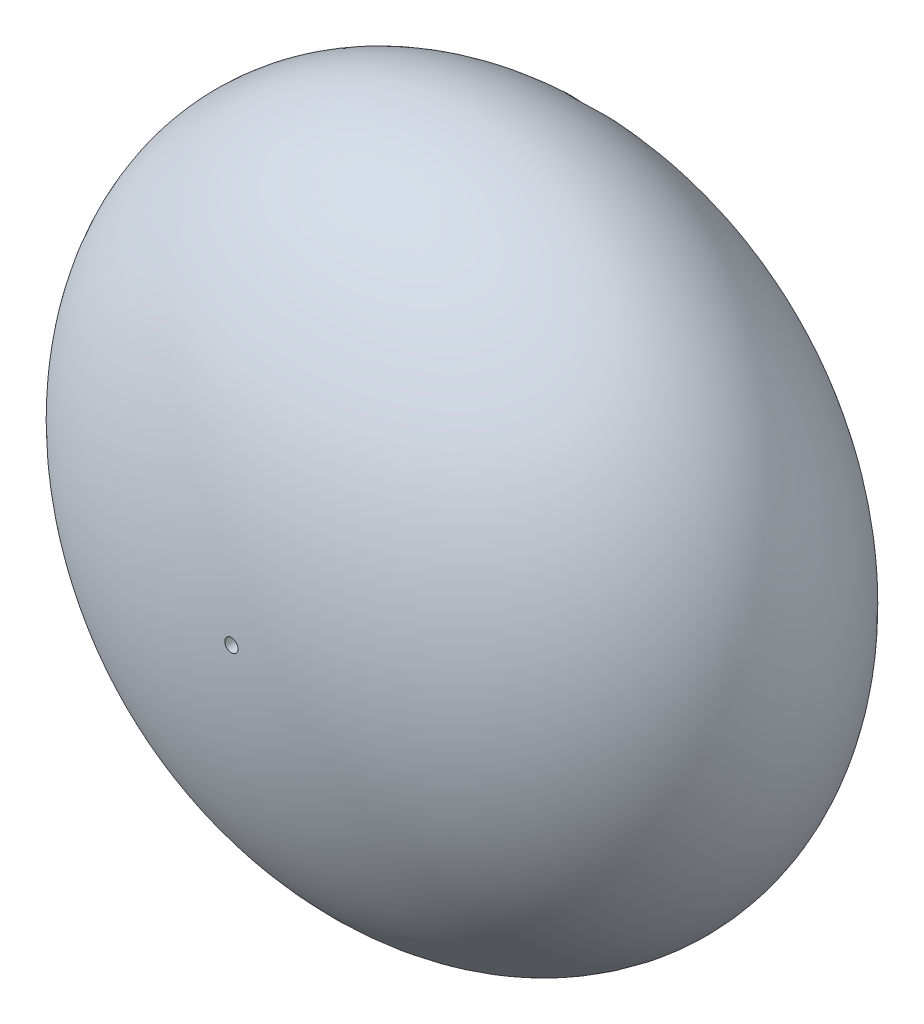
ISO-10303-21;
HEADER;
FILE_DESCRIPTION(('STEP AP214'),'2;1');
FILE_NAME('part.step','',(''),(''),'','','');
FILE_SCHEMA(('AUTOMOTIVE_DESIGN { 1 0 10303 214 1 1 1 1 }'));
ENDSEC;
DATA;
#1=APPLICATION_CONTEXT('core data for automotive mechanical design processes');
#2=APPLICATION_PROTOCOL_DEFINITION('international standard','automotive_design',2000,#1);
#3=PRODUCT_CONTEXT('',#1,'mechanical');
#4=PRODUCT('Part','Part','',(#3));
#5=PRODUCT_RELATED_PRODUCT_CATEGORY('part','',(#4));
#6=PRODUCT_DEFINITION_FORMATION('','',#4);
#7=PRODUCT_DEFINITION_CONTEXT('part definition',#1,'design');
#8=PRODUCT_DEFINITION('design','',#6,#7);
#9=PRODUCT_DEFINITION_SHAPE('','',#8);
#10=(LENGTH_UNIT() NAMED_UNIT(*) SI_UNIT(.MILLI.,.METRE.));
#11=(NAMED_UNIT(*) PLANE_ANGLE_UNIT() SI_UNIT($,.RADIAN.));
#12=(NAMED_UNIT(*) SI_UNIT($,.STERADIAN.) SOLID_ANGLE_UNIT());
#13=UNCERTAINTY_MEASURE_WITH_UNIT(LENGTH_MEASURE(1.E-05),#10,'distance_accuracy_value','');
#14=(GEOMETRIC_REPRESENTATION_CONTEXT(3) GLOBAL_UNCERTAINTY_ASSIGNED_CONTEXT((#13)) GLOBAL_UNIT_ASSIGNED_CONTEXT((#10,
#11,#12)) REPRESENTATION_CONTEXT('',''));
#15=CARTESIAN_POINT('',(0.,0.,0.));
#16=DIRECTION('',(0.,0.,1.));
#17=DIRECTION('',(1.,0.,0.));
#18=AXIS2_PLACEMENT_3D('',#15,#16,#17);
#19=CARTESIAN_POINT('',(0.,0.,-17.5));
#20=DIRECTION('',(0.,0.,1.));
#21=DIRECTION('',(1.,0.,0.));
#22=AXIS2_PLACEMENT_3D('',#19,#20,#21);
#23=CYLINDRICAL_SURFACE('',#22,0.5);
#24=CARTESIAN_POINT('',(0.5,0.,-11.4142135623731));
#25=CARTESIAN_POINT('',(0.500000128973901,0.0272340874053383,-11.4142134726637));
#26=CARTESIAN_POINT('',(0.49776739184907,0.0544673998857626,-11.415008846864));
#27=CARTESIAN_POINT('',(0.488925565851282,0.108127210475308,-11.4180878708729));
#28=CARTESIAN_POINT('',(0.482315756085337,0.134553574931969,-11.4203717658361));
#29=CARTESIAN_POINT('',(0.464977742840131,0.185813446506407,-11.4261410183194));
#30=CARTESIAN_POINT('',(0.454257610701,0.210649964723441,-11.4296240198232));
#31=CARTESIAN_POINT('',(0.429030814221313,0.258180024271898,-11.437395610085));
#32=CARTESIAN_POINT('',(0.414523314430261,0.280873091276248,-11.4416843765272));
#33=CARTESIAN_POINT('',(0.381525573221263,0.324359981169744,-11.4507724470279));
#34=CARTESIAN_POINT('',(0.362912170688913,0.345057714336022,-11.4555844742207));
#35=CARTESIAN_POINT('',(0.322493833607245,0.383103400612162,-11.4650693240075));
#36=CARTESIAN_POINT('',(0.300688387526201,0.400450815791142,-11.4697421241455));
#37=CARTESIAN_POINT('',(0.253802253982492,0.43173944866484,-11.4785693346083));
#38=CARTESIAN_POINT('',(0.228650955612259,0.445579985308991,-11.4827070385078));
#39=CARTESIAN_POINT('',(0.17621561149374,0.468795792563743,-11.4898479338551));
#40=CARTESIAN_POINT('',(0.148932142843607,0.47817226658845,-11.4928514310151));
#41=CARTESIAN_POINT('',(0.094014408716746,0.491867927316199,-11.4972953771595));
#42=CARTESIAN_POINT('',(0.0664253774264834,0.496351723128504,-11.4987865738878));
#43=CARTESIAN_POINT('',(0.0108489374120453,0.50065814668033,-11.5002180410912));
#44=CARTESIAN_POINT('',(-0.0171383667719466,0.500481975826209,-11.5001587113144));
#45=CARTESIAN_POINT('',(-0.0715517575969089,0.495577872716984,-11.4985301980937));
#46=CARTESIAN_POINT('',(-0.0979960242958338,0.491028735762746,-11.4970203237757));
#47=CARTESIAN_POINT('',(-0.14972171941108,0.477803509509773,-11.4927348366986));
#48=CARTESIAN_POINT('',(-0.175003068889588,0.469127140510123,-11.4899591381555));
#49=CARTESIAN_POINT('',(-0.224076237421007,0.447789341346934,-11.4833783514665));
#50=CARTESIAN_POINT('',(-0.2478441104845,0.435077030726608,-11.4795602126216));
#51=CARTESIAN_POINT('',(-0.292962162763584,0.406070147275808,-11.4712919651931));
#52=CARTESIAN_POINT('',(-0.314311667192384,0.389774578336693,-11.4668416810017));
#53=CARTESIAN_POINT('',(-0.355050433275955,0.353162803269618,-11.4575309592554));
#54=CARTESIAN_POINT('',(-0.374300078533783,0.332693421077228,-11.4526610758669));
#55=CARTESIAN_POINT('',(-0.40913862979794,0.288775637138722,-11.443236676222));
#56=CARTESIAN_POINT('',(-0.424726971636483,0.265326777143572,-11.438682208644));
#57=CARTESIAN_POINT('',(-0.451993727521386,0.215673187192099,-11.4303526256911));
#58=CARTESIAN_POINT('',(-0.463613231825601,0.189433934315367,-11.4265895467445));
#59=CARTESIAN_POINT('',(-0.482221596649677,0.135214302867595,-11.4204082543412));
#60=CARTESIAN_POINT('',(-0.48921239787748,0.107234659391798,-11.4179894773182));
#61=CARTESIAN_POINT('',(-0.498080641044514,0.0516808223033321,-11.4148981816901));
#62=CARTESIAN_POINT('',(-0.500174547752903,0.0241452876303246,-11.4141518022317));
#63=CARTESIAN_POINT('',(-0.499802719455807,-0.0308880745586026,-11.4142833609661));
#64=CARTESIAN_POINT('',(-0.497337812612854,-0.058385908015279,-11.415161004136));
#65=CARTESIAN_POINT('',(-0.488112825775626,-0.111578482858766,-11.418368090281));
#66=CARTESIAN_POINT('',(-0.4815031969902,-0.137302715076175,-11.4206466271585));
#67=CARTESIAN_POINT('',(-0.464356931280375,-0.187271803118838,-11.4263427684009));
#68=CARTESIAN_POINT('',(-0.45381959818175,-0.211516395795185,-11.4297605746866));
#69=CARTESIAN_POINT('',(-0.428737170369428,-0.258690210423711,-11.4374843879661));
#70=CARTESIAN_POINT('',(-0.414075559179238,-0.281553321320958,-11.4418151283247));
#71=CARTESIAN_POINT('',(-0.38129281527879,-0.324573026191803,-11.4508288436583));
#72=CARTESIAN_POINT('',(-0.363170662749394,-0.344728819330594,-11.4555119222199));
#73=CARTESIAN_POINT('',(-0.322945852950159,-0.382763992045336,-11.4649751931883));
#74=CARTESIAN_POINT('',(-0.300693635273325,-0.400487195009429,-11.4697492178892));
#75=CARTESIAN_POINT('',(-0.253413645700129,-0.431958071174017,-11.4786342580658));
#76=CARTESIAN_POINT('',(-0.228385972432276,-0.445705885581211,-11.4827452970885));
#77=CARTESIAN_POINT('',(-0.176389931216147,-0.468710052430859,-11.4898220290529));
#78=CARTESIAN_POINT('',(-0.149435561660598,-0.477995638574033,-11.4927951500226));
#79=CARTESIAN_POINT('',(-0.0942292329230079,-0.491863871030052,-11.4972930541889));
#80=CARTESIAN_POINT('',(-0.0659777459769445,-0.496448214940251,-11.4988183601701));
#81=CARTESIAN_POINT('',(-0.0104076679300202,-0.500631038802821,-11.5002093161813));
#82=CARTESIAN_POINT('',(0.0168923619600097,-0.500453726966188,-11.5001496004472));
#83=CARTESIAN_POINT('',(0.0710555725000869,-0.495671345926796,-11.498560982597));
#84=CARTESIAN_POINT('',(0.0979187884095278,-0.491066635923618,-11.4970321996678));
#85=CARTESIAN_POINT('',(0.15002105971603,-0.477708882712016,-11.4927045747721));
#86=CARTESIAN_POINT('',(0.175279135456398,-0.469022892323524,-11.4899262918059));
#87=CARTESIAN_POINT('',(0.223989175469895,-0.447811234451432,-11.4833858035223));
#88=CARTESIAN_POINT('',(0.247440812071205,-0.435284872401529,-11.4796234202395));
#89=CARTESIAN_POINT('',(0.292817008154404,-0.406215243948959,-11.47132934414));
#90=CARTESIAN_POINT('',(0.314653125778848,-0.38954065730904,-11.4667743624619));
#91=CARTESIAN_POINT('',(0.355290513136169,-0.352871304422043,-11.4574649439571));
#92=CARTESIAN_POINT('',(0.374090810812129,-0.332875478869159,-11.452710443857));
#93=CARTESIAN_POINT('',(0.408870904416732,-0.289195322205982,-11.4433163991368));
#94=CARTESIAN_POINT('',(0.424711482999608,-0.265397244509616,-11.4386886399767));
#95=CARTESIAN_POINT('',(0.4521571716499,-0.215332786550673,-11.4303009665815));
#96=CARTESIAN_POINT('',(0.46376338840728,-0.189067053492878,-11.4265408256808));
#97=CARTESIAN_POINT('',(0.481921914103313,-0.136019087988083,-11.4205066711527));
#98=CARTESIAN_POINT('',(0.488678954581634,-0.109313868217138,-11.418173164724));
#99=CARTESIAN_POINT('',(0.497717160080847,-0.0550719747422622,-11.4150269180697));
#100=CARTESIAN_POINT('',(0.499999869598251,-0.0275355912821256,-11.4142136530757));
#101=CARTESIAN_POINT('',(0.5,0.,-11.4142135623731));
#102=B_SPLINE_CURVE_WITH_KNOTS('',3,(#24,#25,#26,#27,#28,#29,#30,#31,#32,#33,#34,#35,#36,#37,
#38,#39,#40,#41,#42,#43,#44,#45,#46,#47,#48,#49,#50,#51,#52,#53,#54,#55,#56,#57,#58,#59,#60,#61,
#62,#63,#64,#65,#66,#67,#68,#69,#70,#71,#72,#73,#74,#75,#76,#77,#78,#79,#80,#81,#82,#83,#84,#85,
#86,#87,#88,#89,#90,#91,#92,#93,#94,#95,#96,#97,#98,#99,#100,#101),.UNSPECIFIED.,.T.,.F.,(4,2,2,
2,2,2,2,2,2,2,2,2,2,2,2,2,2,2,2,2,2,2,2,2,2,2,2,2,2,2,2,2,2,2,2,2,2,2,4),(0.,0.0816002923877086,
0.16321402748444,0.244668313727272,0.326140583069579,0.410506687114699,0.494886325836798,
0.581467530695144,0.668025381910804,0.75157159380153,0.835096266488495,0.915345024104703,
0.995599220923042,1.07690827427853,1.15823995934697,1.24340087179645,1.32857489803739,
1.41496319918688,1.50131525674844,1.58377145676863,1.66621267911373,1.74582197877144,
1.82544539566229,1.90759428860613,1.9897674282382,2.07589404078302,2.16201759371522,
2.24756895588182,2.33308941494834,2.41459042331574,2.49608481997646,2.57628478012971,
2.65649925374377,2.73967759753073,2.82288252209072,2.90934451360828,2.99578389126189,
3.07831606073062,3.16081973585834),.UNSPECIFIED.);
#103=CARTESIAN_POINT('',(0.5,0.,-11.4142135623731));
#104=VERTEX_POINT('',#103);
#105=EDGE_CURVE('E65',#104,#104,#102,.T.);
#106=ORIENTED_EDGE('',*,*,#105,.T.);
#107=EDGE_LOOP('',(#106));
#108=FACE_BOUND('',#107,.T.);
#109=CARTESIAN_POINT('',(0.,0.,-17.4968251088273));
#110=DIRECTION('',(0.,0.,-1.));
#111=DIRECTION('',(-1.,0.,0.));
#112=AXIS2_PLACEMENT_3D('',#109,#110,#111);
#113=CIRCLE('',#112,0.499999999999996);
#114=CARTESIAN_POINT('',(-0.499999999999993,0.,-17.4968251088273));
#115=VERTEX_POINT('',#114);
#116=EDGE_CURVE('E95',#115,#115,#113,.F.);
#117=ORIENTED_EDGE('',*,*,#116,.F.);
#118=EDGE_LOOP('',(#117));
#119=FACE_BOUND('',#118,.T.);
#120=ADVANCED_FACE('F37',(#108,#119),#23,.F.);
#121=CARTESIAN_POINT('',(0.,0.,13.));
#122=DIRECTION('',(0.,0.,-1.));
#123=DIRECTION('',(-1.,0.,0.));
#124=AXIS2_PLACEMENT_3D('',#121,#122,#123);
#125=CYLINDRICAL_SURFACE('',#124,7.);
#126=CARTESIAN_POINT('',(0.,0.,13.));
#127=DIRECTION('',(0.,0.,1.));
#128=DIRECTION('',(1.,0.,0.));
#129=AXIS2_PLACEMENT_3D('',#126,#127,#128);
#130=CIRCLE('',#129,7.);
#131=CARTESIAN_POINT('',(7.,0.,13.));
#132=VERTEX_POINT('',#131);
#133=EDGE_CURVE('E10',#132,#132,#130,.T.);
#134=ORIENTED_EDGE('',*,*,#133,.T.);
#135=EDGE_LOOP('',(#134));
#136=FACE_BOUND('',#135,.T.);
#137=CARTESIAN_POINT('',(0.,0.,0.));
#138=DIRECTION('',(0.,0.,1.));
#139=DIRECTION('',(1.,0.,0.));
#140=AXIS2_PLACEMENT_3D('',#137,#138,#139);
#141=CIRCLE('',#140,7.);
#142=CARTESIAN_POINT('',(7.,0.,0.));
#143=VERTEX_POINT('',#142);
#144=EDGE_CURVE('E51',#143,#143,#141,.T.);
#145=ORIENTED_EDGE('',*,*,#144,.F.);
#146=EDGE_LOOP('',(#145));
#147=FACE_BOUND('',#146,.T.);
#148=ADVANCED_FACE('F115',(#136,#147),#125,.F.);
#149=CARTESIAN_POINT('',(0.,0.,13.));
#150=DIRECTION('',(0.,0.,1.));
#151=DIRECTION('',(1.,0.,0.));
#152=AXIS2_PLACEMENT_3D('',#149,#150,#151);
#153=PLANE('',#152);
#154=CARTESIAN_POINT('',(0.,0.,13.));
#155=DIRECTION('',(0.,0.,1.));
#156=DIRECTION('',(1.,0.,0.));
#157=AXIS2_PLACEMENT_3D('',#154,#155,#156);
#158=CIRCLE('',#157,0.5);
#159=CARTESIAN_POINT('',(0.5,0.,13.));
#160=VERTEX_POINT('',#159);
#161=EDGE_CURVE('E64',#160,#160,#158,.T.);
#162=ORIENTED_EDGE('',*,*,#161,.T.);
#163=EDGE_LOOP('',(#162));
#164=FACE_BOUND('',#163,.T.);
#165=ORIENTED_EDGE('',*,*,#133,.F.);
#166=EDGE_LOOP('',(#165));
#167=FACE_BOUND('',#166,.T.);
#168=ADVANCED_FACE('F120',(#164,#167),#153,.F.);
#169=CARTESIAN_POINT('',(0.,0.,0.));
#170=DIRECTION('',(0.,0.,1.));
#171=DIRECTION('',(1.,0.,0.));
#172=AXIS2_PLACEMENT_3D('',#169,#170,#171);
#173=PLANE('',#172);
#174=CARTESIAN_POINT('',(0.,0.,0.));
#175=DIRECTION('',(0.,0.,1.));
#176=DIRECTION('',(1.,0.,0.));
#177=AXIS2_PLACEMENT_3D('',#174,#175,#176);
#178=CIRCLE('',#177,0.5);
#179=CARTESIAN_POINT('',(0.5,0.,0.));
#180=VERTEX_POINT('',#179);
#181=EDGE_CURVE('E62',#180,#180,#178,.T.);
#182=ORIENTED_EDGE('',*,*,#181,.F.);
#183=EDGE_LOOP('',(#182));
#184=FACE_BOUND('',#183,.T.);
#185=ORIENTED_EDGE('',*,*,#144,.T.);
#186=EDGE_LOOP('',(#185));
#187=FACE_BOUND('',#186,.T.);
#188=ADVANCED_FACE('F111',(#184,#187),#173,.T.);
#189=CARTESIAN_POINT('',(0.5,0.,-8.5857864376269));
#190=CARTESIAN_POINT('',(0.500000128973901,-0.0272340874053383,-8.58578652733633));
#191=CARTESIAN_POINT('',(0.49776739184907,-0.0544673998857626,-8.58499115313597));
#192=CARTESIAN_POINT('',(0.488925565851282,-0.108127210475308,-8.5819121291271));
#193=CARTESIAN_POINT('',(0.482315756085337,-0.134553574931969,-8.5796282341639));
#194=CARTESIAN_POINT('',(0.464977742840131,-0.185813446506407,-8.57385898168056));
#195=CARTESIAN_POINT('',(0.454257610701,-0.210649964723441,-8.5703759801768));
#196=CARTESIAN_POINT('',(0.429030814221313,-0.258180024271898,-8.56260438991496));
#197=CARTESIAN_POINT('',(0.414523314430261,-0.280873091276248,-8.55831562347284));
#198=CARTESIAN_POINT('',(0.381525573221263,-0.324359981169744,-8.54922755297206));
#199=CARTESIAN_POINT('',(0.362912170688913,-0.345057714336022,-8.54441552577931));
#200=CARTESIAN_POINT('',(0.322493833607245,-0.383103400612162,-8.53493067599246));
#201=CARTESIAN_POINT('',(0.300688387526201,-0.400450815791142,-8.53025787585451));
#202=CARTESIAN_POINT('',(0.253802253982492,-0.43173944866484,-8.52143066539171));
#203=CARTESIAN_POINT('',(0.228650955612259,-0.445579985308991,-8.51729296149216));
#204=CARTESIAN_POINT('',(0.17621561149374,-0.468795792563743,-8.5101520661449));
#205=CARTESIAN_POINT('',(0.148932142843607,-0.47817226658845,-8.50714856898494));
#206=CARTESIAN_POINT('',(0.094014408716746,-0.491867927316199,-8.50270462284051));
#207=CARTESIAN_POINT('',(0.0664253774264834,-0.496351723128504,-8.50121342611221));
#208=CARTESIAN_POINT('',(0.0108489374120453,-0.50065814668033,-8.49978195890876));
#209=CARTESIAN_POINT('',(-0.0171383667719467,-0.500481975826209,-8.49984128868555));
#210=CARTESIAN_POINT('',(-0.0715517575969089,-0.495577872716984,-8.50146980190632));
#211=CARTESIAN_POINT('',(-0.0979960242958338,-0.491028735762746,-8.50297967622431));
#212=CARTESIAN_POINT('',(-0.149721719411081,-0.477803509509773,-8.50726516330145));
#213=CARTESIAN_POINT('',(-0.175003068889588,-0.469127140510123,-8.51004086184449));
#214=CARTESIAN_POINT('',(-0.224076237421007,-0.447789341346934,-8.51662164853348));
#215=CARTESIAN_POINT('',(-0.2478441104845,-0.435077030726608,-8.52043978737842));
#216=CARTESIAN_POINT('',(-0.292962162763584,-0.406070147275808,-8.52870803480691));
#217=CARTESIAN_POINT('',(-0.314311667192384,-0.389774578336693,-8.53315831899829));
#218=CARTESIAN_POINT('',(-0.355050433275955,-0.353162803269618,-8.54246904074462));
#219=CARTESIAN_POINT('',(-0.374300078533783,-0.332693421077228,-8.54733892413313));
#220=CARTESIAN_POINT('',(-0.40913862979794,-0.288775637138722,-8.55676332377798));
#221=CARTESIAN_POINT('',(-0.424726971636483,-0.265326777143572,-8.56131779135597));
#222=CARTESIAN_POINT('',(-0.451993727521386,-0.215673187192099,-8.56964737430894));
#223=CARTESIAN_POINT('',(-0.463613231825601,-0.189433934315367,-8.57341045325553));
#224=CARTESIAN_POINT('',(-0.482221596649677,-0.135214302867595,-8.57959174565885));
#225=CARTESIAN_POINT('',(-0.48921239787748,-0.107234659391798,-8.58201052268181));
#226=CARTESIAN_POINT('',(-0.498080641044514,-0.0516808223033321,-8.58510181830986));
#227=CARTESIAN_POINT('',(-0.500174547752903,-0.0241452876303246,-8.58584819776828));
#228=CARTESIAN_POINT('',(-0.499802719455807,0.0308880745586026,-8.58571663903386));
#229=CARTESIAN_POINT('',(-0.497337812612854,0.058385908015279,-8.58483899586398));
#230=CARTESIAN_POINT('',(-0.488112825775626,0.111578482858766,-8.58163190971901));
#231=CARTESIAN_POINT('',(-0.4815031969902,0.137302715076175,-8.57935337284154));
#232=CARTESIAN_POINT('',(-0.464356931280375,0.187271803118838,-8.57365723159914));
#233=CARTESIAN_POINT('',(-0.45381959818175,0.211516395795185,-8.57023942531337));
#234=CARTESIAN_POINT('',(-0.428737170369428,0.258690210423711,-8.5625156120339));
#235=CARTESIAN_POINT('',(-0.414075559179238,0.281553321320958,-8.55818487167531));
#236=CARTESIAN_POINT('',(-0.38129281527879,0.324573026191803,-8.54917115634173));
#237=CARTESIAN_POINT('',(-0.363170662749394,0.344728819330594,-8.54448807778009));
#238=CARTESIAN_POINT('',(-0.32294585295016,0.382763992045336,-8.53502480681174));
#239=CARTESIAN_POINT('',(-0.300693635273325,0.400487195009429,-8.53025078211078));
#240=CARTESIAN_POINT('',(-0.253413645700129,0.431958071174017,-8.52136574193419));
#241=CARTESIAN_POINT('',(-0.228385972432276,0.445705885581211,-8.51725470291145));
#242=CARTESIAN_POINT('',(-0.176389931216147,0.468710052430859,-8.51017797094706));
#243=CARTESIAN_POINT('',(-0.149435561660598,0.477995638574033,-8.50720484997736));
#244=CARTESIAN_POINT('',(-0.0942292329230081,0.491863871030052,-8.50270694581111));
#245=CARTESIAN_POINT('',(-0.0659777459769446,0.496448214940251,-8.5011816398299));
#246=CARTESIAN_POINT('',(-0.0104076679300202,0.500631038802821,-8.49979068381872));
#247=CARTESIAN_POINT('',(0.0168923619600097,0.500453726966188,-8.49985039955279));
#248=CARTESIAN_POINT('',(0.0710555725000869,0.495671345926796,-8.50143901740302));
#249=CARTESIAN_POINT('',(0.0979187884095278,0.491066635923618,-8.50296780033216));
#250=CARTESIAN_POINT('',(0.15002105971603,0.477708882712016,-8.5072954252279));
#251=CARTESIAN_POINT('',(0.175279135456398,0.469022892323524,-8.5100737081941));
#252=CARTESIAN_POINT('',(0.223989175469895,0.447811234451432,-8.51661419647768));
#253=CARTESIAN_POINT('',(0.247440812071205,0.435284872401529,-8.5203765797605));
#254=CARTESIAN_POINT('',(0.292817008154404,0.406215243948959,-8.52867065586));
#255=CARTESIAN_POINT('',(0.314653125778848,0.38954065730904,-8.53322563753809));
#256=CARTESIAN_POINT('',(0.355290513136169,0.352871304422043,-8.54253505604288));
#257=CARTESIAN_POINT('',(0.374090810812129,0.332875478869159,-8.54728955614302));
#258=CARTESIAN_POINT('',(0.408870904416732,0.289195322205982,-8.55668360086318));
#259=CARTESIAN_POINT('',(0.424711482999608,0.265397244509616,-8.56131136002328));
#260=CARTESIAN_POINT('',(0.4521571716499,0.215332786550673,-8.56969903341849));
#261=CARTESIAN_POINT('',(0.46376338840728,0.189067053492878,-8.57345917431915));
#262=CARTESIAN_POINT('',(0.481921914103313,0.136019087988083,-8.57949332884733));
#263=CARTESIAN_POINT('',(0.488678954581634,0.109313868217138,-8.581826835276));
#264=CARTESIAN_POINT('',(0.497717160080847,0.0550719747422622,-8.5849730819303));
#265=CARTESIAN_POINT('',(0.499999869598251,0.0275355912821256,-8.58578634692432));
#266=CARTESIAN_POINT('',(0.5,0.,-8.5857864376269));
#267=B_SPLINE_CURVE_WITH_KNOTS('',3,(#189,#190,#191,#192,#193,#194,#195,#196,#197,#198,#199,
#200,#201,#202,#203,#204,#205,#206,#207,#208,#209,#210,#211,#212,#213,#214,#215,#216,#217,#218,
#219,#220,#221,#222,#223,#224,#225,#226,#227,#228,#229,#230,#231,#232,#233,#234,#235,#236,#237,
#238,#239,#240,#241,#242,#243,#244,#245,#246,#247,#248,#249,#250,#251,#252,#253,#254,#255,#256,
#257,#258,#259,#260,#261,#262,#263,#264,#265,#266),.UNSPECIFIED.,.T.,.F.,(4,2,2,2,2,2,2,2,2,2,2,
2,2,2,2,2,2,2,2,2,2,2,2,2,2,2,2,2,2,2,2,2,2,2,2,2,2,2,4),(0.,0.0816002923877086,
0.16321402748444,0.244668313727272,0.326140583069579,0.410506687114699,0.494886325836798,
0.581467530695144,0.668025381910804,0.75157159380153,0.835096266488495,0.915345024104703,
0.995599220923042,1.07690827427853,1.15823995934697,1.24340087179645,1.32857489803739,
1.41496319918688,1.50131525674844,1.58377145676863,1.66621267911373,1.74582197877144,
1.82544539566229,1.90759428860613,1.9897674282382,2.07589404078302,2.16201759371522,
2.24756895588182,2.33308941494834,2.41459042331574,2.49608481997646,2.57628478012971,
2.65649925374377,2.73967759753073,2.82288252209072,2.90934451360828,2.99578389126189,
3.07831606073062,3.16081973585834),.UNSPECIFIED.);
#268=CARTESIAN_POINT('',(0.5,0.,-8.5857864376269));
#269=VERTEX_POINT('',#268);
#270=EDGE_CURVE('E84',#269,#269,#267,.T.);
#271=ORIENTED_EDGE('',*,*,#270,.T.);
#272=EDGE_LOOP('',(#271));
#273=FACE_BOUND('',#272,.T.);
#274=ORIENTED_EDGE('',*,*,#181,.T.);
#275=EDGE_LOOP('',(#274));
#276=FACE_BOUND('',#275,.T.);
#277=ADVANCED_FACE('F104',(#273,#276),#23,.F.);
#278=ORIENTED_EDGE('',*,*,#161,.F.);
#279=EDGE_LOOP('',(#278));
#280=FACE_BOUND('',#279,.T.);
#281=CARTESIAN_POINT('',(0.,0.,17.4968251088273));
#282=DIRECTION('',(0.,0.,-1.));
#283=DIRECTION('',(-1.,0.,0.));
#284=AXIS2_PLACEMENT_3D('',#281,#282,#283);
#285=CIRCLE('',#284,0.500000000000004);
#286=CARTESIAN_POINT('',(-0.500000000000007,0.,17.4968251088273));
#287=VERTEX_POINT('',#286);
#288=EDGE_CURVE('E56',#287,#287,#285,.T.);
#289=ORIENTED_EDGE('',*,*,#288,.F.);
#290=EDGE_LOOP('',(#289));
#291=FACE_BOUND('',#290,.T.);
#292=ADVANCED_FACE('F76',(#280,#291),#23,.F.);
#293=CARTESIAN_POINT('',(0.,0.,0.));
#294=DIRECTION('',(0.,1.,0.));
#295=DIRECTION('',(-1.,0.,0.));
#296=AXIS2_PLACEMENT_3D('',#293,#294,#295);
#297=ELLIPSE('',#296,26.25,17.5);
#298=TRIMMED_CURVE('',#297,(PARAMETER_VALUE(1.5707963267949)),
(PARAMETER_VALUE(4.71238898038469)),.T.,.PARAMETER.);
#299=CARTESIAN_POINT('',(0.,0.,-17.5));
#300=DIRECTION('',(0.,0.,-1.));
#301=AXIS1_PLACEMENT('',#299,#300);
#302=SURFACE_OF_REVOLUTION('',#298,#301);
#303=CARTESIAN_POINT('',(0.,-22.9455878111675,-8.5));
#304=CARTESIAN_POINT('',(0.0684406943384236,-22.9455839858275,-8.50000461023487));
#305=CARTESIAN_POINT('',(0.136995254534746,-22.9413424871428,-8.5047263947051));
#306=CARTESIAN_POINT('',(0.27191719175889,-22.9246483251306,-8.52327247606626));
#307=CARTESIAN_POINT('',(0.338278739040831,-22.912175376408,-8.53711926027442));
#308=CARTESIAN_POINT('',(0.466449130549073,-22.8799021117155,-8.57282655011607));
#309=CARTESIAN_POINT('',(0.52828282954517,-22.8601460648514,-8.59463863260814));
#310=CARTESIAN_POINT('',(0.646578781872176,-22.8143502617976,-8.64498092366137));
#311=CARTESIAN_POINT('',(0.70304100080022,-22.7883104653659,-8.6735111752465));
#312=CARTESIAN_POINT('',(0.828432470375815,-22.7211143055033,-8.7467519559598));
#313=CARTESIAN_POINT('',(0.894949874554058,-22.6778413138157,-8.79364985091746));
#314=CARTESIAN_POINT('',(1.01677191412042,-22.5841502576876,-8.89435536265194));
#315=CARTESIAN_POINT('',(1.07205505365106,-22.5337188033734,-8.94817591010429));
#316=CARTESIAN_POINT('',(1.18922691481244,-22.408886721579,-9.0802005173018));
#317=CARTESIAN_POINT('',(1.24660485752506,-22.3322926629165,-9.16032477894963));
#318=CARTESIAN_POINT('',(1.34297595604821,-22.1727423079488,-9.32505603725919));
#319=CARTESIAN_POINT('',(1.38194204165845,-22.08977685094,-9.40966943221772));
#320=CARTESIAN_POINT('',(1.45292293178608,-21.8923715065064,-9.60829460273743));
#321=CARTESIAN_POINT('',(1.47867511944,-21.7763881937878,-9.7230120035526));
#322=CARTESIAN_POINT('',(1.50364108555987,-21.5409364687087,-9.95173407280454));
#323=CARTESIAN_POINT('',(1.50281931184632,-21.4214636011995,-10.065737582322));
#324=CARTESIAN_POINT('',(1.47578167978216,-21.1801606579728,-10.2919478691757));
#325=CARTESIAN_POINT('',(1.4491878053105,-21.0583219758117,-10.4041026007582));
#326=CARTESIAN_POINT('',(1.38974683337341,-20.8778403702417,-10.5674051676508));
#327=CARTESIAN_POINT('',(1.36667936798872,-20.8180673661882,-10.6210106787526));
#328=CARTESIAN_POINT('',(1.31380188924561,-20.6997698455646,-10.7262161877995));
#329=CARTESIAN_POINT('',(1.28399476905899,-20.6412448050362,-10.7778170351932));
#330=CARTESIAN_POINT('',(1.20640370129186,-20.5072602279182,-10.894997729322));
#331=CARTESIAN_POINT('',(1.1559277721826,-20.4325097138337,-10.9596416621146));
#332=CARTESIAN_POINT('',(1.04139104030104,-20.288622634724,-11.0828543693069));
#333=CARTESIAN_POINT('',(0.977351288963276,-20.2194775971778,-11.1414323508538));
#334=CARTESIAN_POINT('',(0.854741106589615,-20.1089168678554,-11.2343019752804));
#335=CARTESIAN_POINT('',(0.799883402463806,-20.0652411428432,-11.2707365377406));
#336=CARTESIAN_POINT('',(0.711638668545196,-20.0048238860939,-11.3208753473474));
#337=CARTESIAN_POINT('',(0.681252424477544,-19.98554507542,-11.336827199843));
#338=CARTESIAN_POINT('',(0.618440740897952,-19.9489653355697,-11.367021479499));
#339=CARTESIAN_POINT('',(0.586012845656724,-19.9316668616435,-11.381261785727));
#340=CARTESIAN_POINT('',(0.501425710646234,-19.8908676173062,-11.4147780366875));
#341=CARTESIAN_POINT('',(0.447933712218068,-19.868951901651,-11.4327118827619));
#342=CARTESIAN_POINT('',(0.337087996226225,-19.8321577869428,-11.4627571549734));
#343=CARTESIAN_POINT('',(0.279741163266981,-19.8172672037036,-11.4748786624645));
#344=CARTESIAN_POINT('',(0.161984848258558,-19.7956948983987,-11.4924228467346));
#345=CARTESIAN_POINT('',(0.101554417738358,-19.7890802635467,-11.4977907790203));
#346=CARTESIAN_POINT('',(-0.0198133641324777,-19.7850096760781,-11.501095414799));
#347=CARTESIAN_POINT('',(-0.0807505237042208,-19.7875504029926,-11.4990348124745));
#348=CARTESIAN_POINT('',(-0.193950641142481,-19.8006787128763,-11.4883695032601));
#349=CARTESIAN_POINT('',(-0.246406067052267,-19.8103086478555,-11.4805435290312));
#350=CARTESIAN_POINT('',(-0.348793330310287,-19.8357518168038,-11.4598200000281));
#351=CARTESIAN_POINT('',(-0.398722196216279,-19.8515721486985,-11.4469166233949));
#352=CARTESIAN_POINT('',(-0.480285746023278,-19.8826910699791,-11.4214601105522));
#353=CARTESIAN_POINT('',(-0.512808455804297,-19.8966420922046,-11.410029331236));
#354=CARTESIAN_POINT('',(-0.576101243385815,-19.9266666834692,-11.3853732640379));
#355=CARTESIAN_POINT('',(-0.606872915362219,-19.9427382761766,-11.3721496467351));
#356=CARTESIAN_POINT('',(-0.69663218221808,-19.9937565804985,-11.3300664070246));
#357=CARTESIAN_POINT('',(-0.752951763167309,-20.031462081168,-11.2988308514624));
#358=CARTESIAN_POINT('',(-0.883243678063135,-20.1309897463929,-11.2158739293575));
#359=CARTESIAN_POINT('',(-0.953110099876698,-20.1958298646803,-11.1614145554316));
#360=CARTESIAN_POINT('',(-1.07897316913992,-20.3323826944764,-11.0455375548296));
#361=CARTESIAN_POINT('',(-1.13494105168761,-20.4041092401616,-10.9841058744033));
#362=CARTESIAN_POINT('',(-1.22071824427914,-20.5316464197828,-10.8736771671968));
#363=CARTESIAN_POINT('',(-1.25350465323984,-20.5864941779139,-10.8258296019925));
#364=CARTESIAN_POINT('',(-1.31273383352017,-20.6977199698168,-10.7280108111434));
#365=CARTESIAN_POINT('',(-1.33917386340607,-20.7540986532363,-10.6780386786855));
#366=CARTESIAN_POINT('',(-1.40939326751732,-20.9247479007675,-10.525510685559));
#367=CARTESIAN_POINT('',(-1.44407193397958,-21.0405316278553,-10.420343258743));
#368=CARTESIAN_POINT('',(-1.4904273192091,-21.275556759458,-10.2031321052231));
#369=CARTESIAN_POINT('',(-1.50151391133386,-21.3948128548061,-10.0909826397558));
#370=CARTESIAN_POINT('',(-1.4981594459168,-21.6311304546571,-9.86474794694167));
#371=CARTESIAN_POINT('',(-1.48374050772733,-21.7481937718537,-9.75066448180223));
#372=CARTESIAN_POINT('',(-1.43287773448811,-21.9540138409937,-9.54656685529652));
#373=CARTESIAN_POINT('',(-1.40141276095373,-22.043751288084,-9.45629994188205));
#374=CARTESIAN_POINT('',(-1.31904381779991,-22.2175370994617,-9.27913845272882));
#375=CARTESIAN_POINT('',(-1.26816718189918,-22.3015932685779,-9.19223932346282));
#376=CARTESIAN_POINT('',(-1.16129132494728,-22.4398885600721,-9.04751296713745));
#377=CARTESIAN_POINT('',(-1.11015016835788,-22.4961592107876,-8.98804624886168));
#378=CARTESIAN_POINT('',(-0.995574502533933,-22.6021200579801,-8.87515155694335));
#379=CARTESIAN_POINT('',(-0.932142526704015,-22.6518116070058,-8.82172234242714));
#380=CARTESIAN_POINT('',(-0.807644649913705,-22.7326498359332,-8.73421148346226));
#381=CARTESIAN_POINT('',(-0.748890070363984,-22.7654984932076,-8.69842446860914));
#382=CARTESIAN_POINT('',(-0.624328285907605,-22.8240889802911,-8.63431636224017));
#383=CARTESIAN_POINT('',(-0.558541857812536,-22.8498509846338,-8.605974087389));
#384=CARTESIAN_POINT('',(-0.430637287136873,-22.8899045183309,-8.56177876536238));
#385=CARTESIAN_POINT('',(-0.369271890508031,-22.905290199004,-8.54473998860493));
#386=CARTESIAN_POINT('',(-0.243632341476699,-22.9289190156702,-8.51853590015081));
#387=CARTESIAN_POINT('',(-0.179366027490281,-22.9371803134702,-8.50935056860299));
#388=CARTESIAN_POINT('',(-0.0955677546841991,-22.9429585632584,-8.50292468019137));
#389=CARTESIAN_POINT('',(-0.0764875275670354,-22.9439432642984,-8.50182944667376));
#390=CARTESIAN_POINT('',(-0.0382745072436862,-22.9452584689001,-8.50036641105353));
#391=CARTESIAN_POINT('',(-0.0191417070663456,-22.9455888810506,-8.49999871059511));
#392=CARTESIAN_POINT('',(0.,-22.9455878111675,-8.5));
#393=B_SPLINE_CURVE_WITH_KNOTS('',3,(#303,#304,#305,#306,#307,#308,#309,#310,#311,#312,#313,
#314,#315,#316,#317,#318,#319,#320,#321,#322,#323,#324,#325,#326,#327,#328,#329,#330,#331,#332,
#333,#334,#335,#336,#337,#338,#339,#340,#341,#342,#343,#344,#345,#346,#347,#348,#349,#350,#351,
#352,#353,#354,#355,#356,#357,#358,#359,#360,#361,#362,#363,#364,#365,#366,#367,#368,#369,#370,
#371,#372,#373,#374,#375,#376,#377,#378,#379,#380,#381,#382,#383,#384,#385,#386,#387,#388,#389,
#390,#391,#392),.UNSPECIFIED.,.T.,.F.,(4,2,2,2,2,2,2,2,2,2,2,2,2,2,2,2,2,2,2,2,2,2,2,2,2,2,2,2,
2,2,2,2,2,2,2,2,2,2,2,2,2,2,2,2,4),(0.,0.205237059765106,0.410981799203147,0.615496036167375,
0.820011582901349,1.09502749787901,1.37056477898558,1.74297292734039,2.11592692143264,
2.60878746232031,3.10230740773557,3.6031774291356,3.85354303682262,4.10380137193439,
4.4357600507016,4.76720724685816,5.00344935576961,5.12141704975564,5.23952945310511,
5.42036904574649,5.60089383182278,5.78287271707902,5.96478560883467,6.12580679444761,
6.28701315095882,6.39843733056069,6.50975838890522,6.73277433628332,7.06036537165187,
7.38862885379987,7.62781270619426,7.86709969320483,8.34567381680504,8.83608462634049,
9.32607034172155,9.71810961023089,10.1095988703078,10.3982279366889,10.6867975735199,
10.9146387947424,11.1418245140213,11.3375626279443,11.532800269557,11.5901935932875,
11.6475949349185),.UNSPECIFIED.);
#394=CARTESIAN_POINT('',(0.,-22.9455878111675,-8.5));
#395=VERTEX_POINT('',#394);
#396=EDGE_CURVE('E43',#395,#395,#393,.T.);
#397=ORIENTED_EDGE('',*,*,#396,.T.);
#398=EDGE_LOOP('',(#397));
#399=FACE_BOUND('',#398,.T.);
#400=CARTESIAN_POINT('',(0.,22.9455878111675,-8.5));
#401=CARTESIAN_POINT('',(-0.0684406943384236,22.9455839858275,-8.50000461023487));
#402=CARTESIAN_POINT('',(-0.136995254534746,22.9413424871428,-8.5047263947051));
#403=CARTESIAN_POINT('',(-0.27191719175889,22.9246483251306,-8.52327247606626));
#404=CARTESIAN_POINT('',(-0.338278739040831,22.912175376408,-8.53711926027442));
#405=CARTESIAN_POINT('',(-0.466449130549073,22.8799021117155,-8.57282655011607));
#406=CARTESIAN_POINT('',(-0.52828282954517,22.8601460648514,-8.59463863260814));
#407=CARTESIAN_POINT('',(-0.646578781872176,22.8143502617976,-8.64498092366137));
#408=CARTESIAN_POINT('',(-0.70304100080022,22.7883104653659,-8.6735111752465));
#409=CARTESIAN_POINT('',(-0.828432470375814,22.7211143055033,-8.7467519559598));
#410=CARTESIAN_POINT('',(-0.894949874554056,22.6778413138157,-8.79364985091746));
#411=CARTESIAN_POINT('',(-1.01677191412041,22.5841502576876,-8.89435536265194));
#412=CARTESIAN_POINT('',(-1.07205505365105,22.5337188033734,-8.94817591010429));
#413=CARTESIAN_POINT('',(-1.18922691481242,22.408886721579,-9.08020051730179));
#414=CARTESIAN_POINT('',(-1.24660485752506,22.3322926629165,-9.16032477894962));
#415=CARTESIAN_POINT('',(-1.34297595604821,22.1727423079488,-9.32505603725919));
#416=CARTESIAN_POINT('',(-1.38194204165844,22.08977685094,-9.40966943221772));
#417=CARTESIAN_POINT('',(-1.45292293178607,21.8923715065064,-9.60829460273743));
#418=CARTESIAN_POINT('',(-1.47867511944,21.7763881937878,-9.72301200355259));
#419=CARTESIAN_POINT('',(-1.50364108555987,21.5409364687087,-9.95173407280453));
#420=CARTESIAN_POINT('',(-1.50281931184631,21.4214636011995,-10.065737582322));
#421=CARTESIAN_POINT('',(-1.47578167978215,21.1801606579729,-10.2919478691757));
#422=CARTESIAN_POINT('',(-1.4491878053105,21.0583219758117,-10.4041026007582));
#423=CARTESIAN_POINT('',(-1.38974683337341,20.8778403702417,-10.5674051676508));
#424=CARTESIAN_POINT('',(-1.36667936798873,20.8180673661882,-10.6210106787526));
#425=CARTESIAN_POINT('',(-1.31380188924561,20.6997698455646,-10.7262161877995));
#426=CARTESIAN_POINT('',(-1.28399476905901,20.6412448050362,-10.7778170351932));
#427=CARTESIAN_POINT('',(-1.20640370129189,20.5072602279182,-10.894997729322));
#428=CARTESIAN_POINT('',(-1.15592777218262,20.4325097138337,-10.9596416621146));
#429=CARTESIAN_POINT('',(-1.04139104030105,20.288622634724,-11.0828543693069));
#430=CARTESIAN_POINT('',(-0.977351288963285,20.2194775971778,-11.1414323508538));
#431=CARTESIAN_POINT('',(-0.854741106589627,20.1089168678554,-11.2343019752804));
#432=CARTESIAN_POINT('',(-0.79988340246382,20.0652411428432,-11.2707365377406));
#433=CARTESIAN_POINT('',(-0.71163866854521,20.0048238860939,-11.3208753473474));
#434=CARTESIAN_POINT('',(-0.681252424477559,19.98554507542,-11.336827199843));
#435=CARTESIAN_POINT('',(-0.618440740897964,19.9489653355697,-11.367021479499));
#436=CARTESIAN_POINT('',(-0.586012845656733,19.9316668616435,-11.3812617857269));
#437=CARTESIAN_POINT('',(-0.501425710646239,19.8908676173062,-11.4147780366875));
#438=CARTESIAN_POINT('',(-0.447933712218075,19.868951901651,-11.4327118827619));
#439=CARTESIAN_POINT('',(-0.337087996226233,19.8321577869428,-11.4627571549734));
#440=CARTESIAN_POINT('',(-0.279741163266991,19.8172672037036,-11.4748786624645));
#441=CARTESIAN_POINT('',(-0.161984848258569,19.7956948983987,-11.4924228467346));
#442=CARTESIAN_POINT('',(-0.101554417738369,19.7890802635467,-11.4977907790203));
#443=CARTESIAN_POINT('',(0.0198133641324668,19.7850096760781,-11.501095414799));
#444=CARTESIAN_POINT('',(0.0807505237042099,19.7875504029926,-11.4990348124745));
#445=CARTESIAN_POINT('',(0.193950641142473,19.8006787128763,-11.4883695032601));
#446=CARTESIAN_POINT('',(0.246406067052261,19.8103086478555,-11.4805435290312));
#447=CARTESIAN_POINT('',(0.348793330310287,19.8357518168038,-11.4598200000281));
#448=CARTESIAN_POINT('',(0.398722196216282,19.8515721486985,-11.4469166233949));
#449=CARTESIAN_POINT('',(0.480285746023282,19.8826910699791,-11.4214601105522));
#450=CARTESIAN_POINT('',(0.5128084558043,19.8966420922046,-11.410029331236));
#451=CARTESIAN_POINT('',(0.576101243385818,19.9266666834692,-11.3853732640379));
#452=CARTESIAN_POINT('',(0.606872915362223,19.9427382761766,-11.3721496467351));
#453=CARTESIAN_POINT('',(0.696632182218086,19.9937565804985,-11.3300664070246));
#454=CARTESIAN_POINT('',(0.75295176316731,20.0314620811681,-11.2988308514624));
#455=CARTESIAN_POINT('',(0.883243678063129,20.130989746393,-11.2158739293575));
#456=CARTESIAN_POINT('',(0.953110099876698,20.1958298646804,-11.1614145554316));
#457=CARTESIAN_POINT('',(1.07897316913993,20.3323826944764,-11.0455375548296));
#458=CARTESIAN_POINT('',(1.13494105168761,20.4041092401616,-10.9841058744033));
#459=CARTESIAN_POINT('',(1.22071824427913,20.5316464197828,-10.8736771671968));
#460=CARTESIAN_POINT('',(1.25350465323984,20.5864941779139,-10.8258296019925));
#461=CARTESIAN_POINT('',(1.31273383352017,20.6977199698168,-10.7280108111434));
#462=CARTESIAN_POINT('',(1.33917386340607,20.7540986532363,-10.6780386786855));
#463=CARTESIAN_POINT('',(1.40939326751732,20.9247479007675,-10.525510685559));
#464=CARTESIAN_POINT('',(1.44407193397959,21.0405316278553,-10.420343258743));
#465=CARTESIAN_POINT('',(1.49042731920911,21.275556759458,-10.2031321052231));
#466=CARTESIAN_POINT('',(1.50151391133386,21.3948128548061,-10.0909826397558));
#467=CARTESIAN_POINT('',(1.4981594459168,21.6311304546571,-9.86474794694167));
#468=CARTESIAN_POINT('',(1.48374050772734,21.7481937718537,-9.75066448180224));
#469=CARTESIAN_POINT('',(1.43287773448812,21.9540138409937,-9.54656685529653));
#470=CARTESIAN_POINT('',(1.40141276095373,22.043751288084,-9.45629994188205));
#471=CARTESIAN_POINT('',(1.31904381779991,22.2175370994617,-9.27913845272883));
#472=CARTESIAN_POINT('',(1.26816718189918,22.3015932685779,-9.19223932346282));
#473=CARTESIAN_POINT('',(1.16129132494728,22.4398885600721,-9.04751296713746));
#474=CARTESIAN_POINT('',(1.11015016835789,22.4961592107876,-8.98804624886168));
#475=CARTESIAN_POINT('',(0.995574502533935,22.6021200579801,-8.87515155694335));
#476=CARTESIAN_POINT('',(0.932142526704016,22.6518116070058,-8.82172234242714));
#477=CARTESIAN_POINT('',(0.807644649913705,22.7326498359332,-8.73421148346226));
#478=CARTESIAN_POINT('',(0.748890070363984,22.7654984932076,-8.69842446860914));
#479=CARTESIAN_POINT('',(0.624328285907605,22.8240889802911,-8.63431636224017));
#480=CARTESIAN_POINT('',(0.558541857812536,22.8498509846338,-8.605974087389));
#481=CARTESIAN_POINT('',(0.430637287136873,22.8899045183309,-8.56177876536238));
#482=CARTESIAN_POINT('',(0.369271890508031,22.905290199004,-8.54473998860493));
#483=CARTESIAN_POINT('',(0.243632341476699,22.9289190156702,-8.51853590015081));
#484=CARTESIAN_POINT('',(0.179366027490281,22.9371803134702,-8.50935056860299));
#485=CARTESIAN_POINT('',(0.0955677546841992,22.9429585632584,-8.50292468019137));
#486=CARTESIAN_POINT('',(0.0764875275670355,22.9439432642984,-8.50182944667376));
#487=CARTESIAN_POINT('',(0.0382745072436862,22.9452584689001,-8.50036641105353));
#488=CARTESIAN_POINT('',(0.0191417070663457,22.9455888810506,-8.49999871059511));
#489=CARTESIAN_POINT('',(0.,22.9455878111675,-8.5));
#490=B_SPLINE_CURVE_WITH_KNOTS('',3,(#400,#401,#402,#403,#404,#405,#406,#407,#408,#409,#410,
#411,#412,#413,#414,#415,#416,#417,#418,#419,#420,#421,#422,#423,#424,#425,#426,#427,#428,#429,
#430,#431,#432,#433,#434,#435,#436,#437,#438,#439,#440,#441,#442,#443,#444,#445,#446,#447,#448,
#449,#450,#451,#452,#453,#454,#455,#456,#457,#458,#459,#460,#461,#462,#463,#464,#465,#466,#467,
#468,#469,#470,#471,#472,#473,#474,#475,#476,#477,#478,#479,#480,#481,#482,#483,#484,#485,#486,
#487,#488,#489),.UNSPECIFIED.,.T.,.F.,(4,2,2,2,2,2,2,2,2,2,2,2,2,2,2,2,2,2,2,2,2,2,2,2,2,2,2,2,
2,2,2,2,2,2,2,2,2,2,2,2,2,2,2,2,4),(0.,0.205237059765106,0.410981799203147,0.615496036167375,
0.820011582901349,1.095027497879,1.37056477898556,1.74297292734037,2.11592692143262,
2.6087874623203,3.10230740773556,3.60317742913559,3.8535430368226,4.10380137193437,
4.43576005070158,4.76720724685814,5.00344935576959,5.12141704975562,5.23952945310509,
5.42036904574647,5.60089383182277,5.78287271707901,5.96478560883466,6.1258067944476,
6.28701315095882,6.39843733056069,6.50975838890522,6.73277433628333,7.06036537165187,
7.38862885379985,7.62781270619425,7.86709969320482,8.34567381680503,8.83608462634048,
9.32607034172154,9.71810961023088,10.1095988703078,10.3982279366889,10.6867975735199,
10.9146387947423,11.1418245140213,11.3375626279443,11.532800269557,11.5901935932875,
11.6475949349185),.UNSPECIFIED.);
#491=CARTESIAN_POINT('',(0.,22.9455878111675,-8.5));
#492=VERTEX_POINT('',#491);
#493=EDGE_CURVE('E66',#492,#492,#490,.T.);
#494=ORIENTED_EDGE('',*,*,#493,.T.);
#495=EDGE_LOOP('',(#494));
#496=FACE_BOUND('',#495,.T.);
#497=ORIENTED_EDGE('',*,*,#288,.T.);
#498=EDGE_LOOP('',(#497));
#499=FACE_BOUND('',#498,.T.);
#500=ORIENTED_EDGE('',*,*,#116,.T.);
#501=EDGE_LOOP('',(#500));
#502=FACE_BOUND('',#501,.T.);
#503=ADVANCED_FACE('F39',(#399,#496,#499,#502),#302,.T.);
#504=CARTESIAN_POINT('',(0.,-26.25,-10.));
#505=DIRECTION('',(0.,1.,0.));
#506=DIRECTION('',(0.,0.,1.));
#507=AXIS2_PLACEMENT_3D('',#504,#505,#506);
#508=CYLINDRICAL_SURFACE('',#507,1.5);
#509=ORIENTED_EDGE('',*,*,#270,.F.);
#510=EDGE_LOOP('',(#509));
#511=FACE_BOUND('',#510,.T.);
#512=ORIENTED_EDGE('',*,*,#493,.F.);
#513=EDGE_LOOP('',(#512));
#514=FACE_BOUND('',#513,.T.);
#515=ORIENTED_EDGE('',*,*,#396,.F.);
#516=EDGE_LOOP('',(#515));
#517=FACE_BOUND('',#516,.T.);
#518=ORIENTED_EDGE('',*,*,#105,.F.);
#519=EDGE_LOOP('',(#518));
#520=FACE_BOUND('',#519,.T.);
#521=ADVANCED_FACE('F71',(#511,#514,#517,#520),#508,.F.);
#522=CLOSED_SHELL('',(#120,#148,#168,#188,#277,#292,#503,#521));
#523=MANIFOLD_SOLID_BREP('B2',#522);
#524=ADVANCED_BREP_SHAPE_REPRESENTATION('',(#18,#523),#14);
#525=SHAPE_DEFINITION_REPRESENTATION(#9,#524);
ENDSEC;
END-ISO-10303-21;
